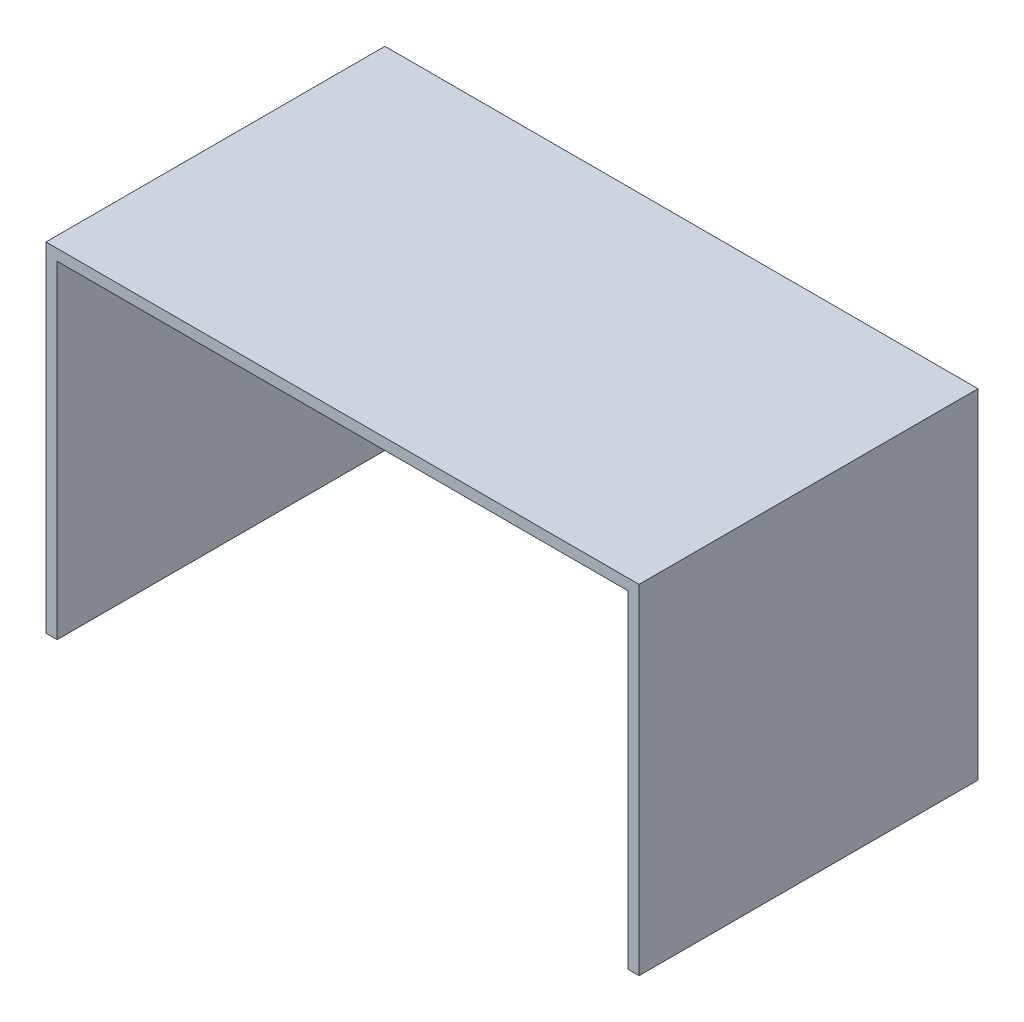
ISO-10303-21;
HEADER;
FILE_DESCRIPTION(('STEP AP214'),'2;1');
FILE_NAME('part.step','',(''),(''),'','','');
FILE_SCHEMA(('AUTOMOTIVE_DESIGN { 1 0 10303 214 1 1 1 1 }'));
ENDSEC;
DATA;
#1=APPLICATION_CONTEXT('core data for automotive mechanical design processes');
#2=APPLICATION_PROTOCOL_DEFINITION('international standard','automotive_design',2000,#1);
#3=PRODUCT_CONTEXT('',#1,'mechanical');
#4=PRODUCT('Part','Part','',(#3));
#5=PRODUCT_RELATED_PRODUCT_CATEGORY('part','',(#4));
#6=PRODUCT_DEFINITION_FORMATION('','',#4);
#7=PRODUCT_DEFINITION_CONTEXT('part definition',#1,'design');
#8=PRODUCT_DEFINITION('design','',#6,#7);
#9=PRODUCT_DEFINITION_SHAPE('','',#8);
#10=(LENGTH_UNIT() NAMED_UNIT(*) SI_UNIT(.MILLI.,.METRE.));
#11=(NAMED_UNIT(*) PLANE_ANGLE_UNIT() SI_UNIT($,.RADIAN.));
#12=(NAMED_UNIT(*) SI_UNIT($,.STERADIAN.) SOLID_ANGLE_UNIT());
#13=UNCERTAINTY_MEASURE_WITH_UNIT(LENGTH_MEASURE(1.E-05),#10,'distance_accuracy_value','');
#14=(GEOMETRIC_REPRESENTATION_CONTEXT(3) GLOBAL_UNCERTAINTY_ASSIGNED_CONTEXT((#13)) GLOBAL_UNIT_ASSIGNED_CONTEXT((#10,
#11,#12)) REPRESENTATION_CONTEXT('',''));
#15=CARTESIAN_POINT('',(0.,0.,0.));
#16=DIRECTION('',(0.,0.,1.));
#17=DIRECTION('',(1.,0.,0.));
#18=AXIS2_PLACEMENT_3D('',#15,#16,#17);
#19=CARTESIAN_POINT('',(0.2667,-0.1524,0.1524));
#20=DIRECTION('',(-1.,0.,0.));
#21=DIRECTION('',(0.,0.,1.));
#22=AXIS2_PLACEMENT_3D('',#19,#20,#21);
#23=PLANE('',#22);
#24=DIRECTION('',(0.,1.,0.));
#25=VECTOR('',#24,1.);
#26=CARTESIAN_POINT('',(0.2667,-0.1524,-0.1524));
#27=LINE('',#26,#25);
#28=CARTESIAN_POINT('',(0.2667,-0.1524,-0.1524));
#29=VERTEX_POINT('',#28);
#30=CARTESIAN_POINT('',(0.2667,0.1524,-0.1524));
#31=VERTEX_POINT('',#30);
#32=EDGE_CURVE('E145',#29,#31,#27,.T.);
#33=ORIENTED_EDGE('',*,*,#32,.T.);
#34=DIRECTION('',(0.,0.,-1.));
#35=VECTOR('',#34,1.);
#36=CARTESIAN_POINT('',(0.2667,0.1524,0.1524));
#37=LINE('',#36,#35);
#38=CARTESIAN_POINT('',(0.2667,0.1524,0.1524));
#39=VERTEX_POINT('',#38);
#40=EDGE_CURVE('E12',#39,#31,#37,.T.);
#41=ORIENTED_EDGE('',*,*,#40,.F.);
#42=DIRECTION('',(0.,1.,0.));
#43=VECTOR('',#42,1.);
#44=CARTESIAN_POINT('',(0.2667,-0.1524,0.1524));
#45=LINE('',#44,#43);
#46=CARTESIAN_POINT('',(0.2667,-0.1524,0.1524));
#47=VERTEX_POINT('',#46);
#48=EDGE_CURVE('E146',#47,#39,#45,.T.);
#49=ORIENTED_EDGE('',*,*,#48,.F.);
#50=DIRECTION('',(0.,0.,-1.));
#51=VECTOR('',#50,1.);
#52=CARTESIAN_POINT('',(0.2667,-0.1524,0.1524));
#53=LINE('',#52,#51);
#54=EDGE_CURVE('E158',#47,#29,#53,.T.);
#55=ORIENTED_EDGE('',*,*,#54,.T.);
#56=EDGE_LOOP('',(#33,#41,#49,#55));
#57=FACE_BOUND('',#56,.T.);
#58=ADVANCED_FACE('F41',(#57),#23,.F.);
#59=CARTESIAN_POINT('',(-0.2667,0.1524,0.1524));
#60=DIRECTION('',(0.,-1.,0.));
#61=DIRECTION('',(0.,0.,-1.));
#62=AXIS2_PLACEMENT_3D('',#59,#60,#61);
#63=PLANE('',#62);
#64=DIRECTION('',(-1.,0.,0.));
#65=VECTOR('',#64,1.);
#66=CARTESIAN_POINT('',(-0.2667,0.1524,-0.1524));
#67=LINE('',#66,#65);
#68=CARTESIAN_POINT('',(-0.2667,0.1524,-0.1524));
#69=VERTEX_POINT('',#68);
#70=EDGE_CURVE('E162',#31,#69,#67,.T.);
#71=ORIENTED_EDGE('',*,*,#70,.T.);
#72=DIRECTION('',(0.,0.,-1.));
#73=VECTOR('',#72,1.);
#74=CARTESIAN_POINT('',(-0.2667,0.1524,0.1524));
#75=LINE('',#74,#73);
#76=CARTESIAN_POINT('',(-0.2667,0.1524,0.1524));
#77=VERTEX_POINT('',#76);
#78=EDGE_CURVE('E49',#77,#69,#75,.T.);
#79=ORIENTED_EDGE('',*,*,#78,.F.);
#80=DIRECTION('',(-1.,0.,0.));
#81=VECTOR('',#80,1.);
#82=CARTESIAN_POINT('',(-0.2667,0.1524,0.1524));
#83=LINE('',#82,#81);
#84=EDGE_CURVE('E94',#39,#77,#83,.T.);
#85=ORIENTED_EDGE('',*,*,#84,.F.);
#86=ORIENTED_EDGE('',*,*,#40,.T.);
#87=EDGE_LOOP('',(#71,#79,#85,#86));
#88=FACE_BOUND('',#87,.T.);
#89=ADVANCED_FACE('F218',(#88),#63,.F.);
#90=CARTESIAN_POINT('',(-0.2667,-0.1524,0.1524));
#91=DIRECTION('',(1.,0.,0.));
#92=DIRECTION('',(0.,0.,-1.));
#93=AXIS2_PLACEMENT_3D('',#90,#91,#92);
#94=PLANE('',#93);
#95=DIRECTION('',(0.,-1.,0.));
#96=VECTOR('',#95,1.);
#97=CARTESIAN_POINT('',(-0.2667,-0.1524,-0.1524));
#98=LINE('',#97,#96);
#99=CARTESIAN_POINT('',(-0.2667,-0.1524,-0.1524));
#100=VERTEX_POINT('',#99);
#101=EDGE_CURVE('E165',#69,#100,#98,.T.);
#102=ORIENTED_EDGE('',*,*,#101,.T.);
#103=DIRECTION('',(0.,0.,-1.));
#104=VECTOR('',#103,1.);
#105=CARTESIAN_POINT('',(-0.2667,-0.1524,0.1524));
#106=LINE('',#105,#104);
#107=CARTESIAN_POINT('',(-0.2667,-0.1524,0.1524));
#108=VERTEX_POINT('',#107);
#109=EDGE_CURVE('E172',#108,#100,#106,.T.);
#110=ORIENTED_EDGE('',*,*,#109,.F.);
#111=DIRECTION('',(0.,-1.,0.));
#112=VECTOR('',#111,1.);
#113=CARTESIAN_POINT('',(-0.2667,-0.1524,0.1524));
#114=LINE('',#113,#112);
#115=EDGE_CURVE('E151',#77,#108,#114,.T.);
#116=ORIENTED_EDGE('',*,*,#115,.F.);
#117=ORIENTED_EDGE('',*,*,#78,.T.);
#118=EDGE_LOOP('',(#102,#110,#116,#117));
#119=FACE_BOUND('',#118,.T.);
#120=ADVANCED_FACE('F179',(#119),#94,.F.);
#121=CARTESIAN_POINT('',(-0.2667,-0.1524,0.1524));
#122=DIRECTION('',(0.,1.,0.));
#123=DIRECTION('',(0.,0.,1.));
#124=AXIS2_PLACEMENT_3D('',#121,#122,#123);
#125=PLANE('',#124);
#126=DIRECTION('',(1.,0.,0.));
#127=VECTOR('',#126,1.);
#128=CARTESIAN_POINT('',(-0.2667,-0.1524,0.1524));
#129=LINE('',#128,#127);
#130=CARTESIAN_POINT('',(0.2567,-0.1524,0.1524));
#131=VERTEX_POINT('',#130);
#132=EDGE_CURVE('E65',#131,#47,#129,.T.);
#133=ORIENTED_EDGE('',*,*,#132,.F.);
#134=DIRECTION('',(0.,0.,1.));
#135=VECTOR('',#134,1.);
#136=CARTESIAN_POINT('',(0.2567,-0.1524,-0.744419087530123));
#137=LINE('',#136,#135);
#138=CARTESIAN_POINT('',(0.2567,-0.1524,-0.1424));
#139=VERTEX_POINT('',#138);
#140=EDGE_CURVE('E122',#139,#131,#137,.T.);
#141=ORIENTED_EDGE('',*,*,#140,.F.);
#142=DIRECTION('',(1.,0.,0.));
#143=VECTOR('',#142,1.);
#144=CARTESIAN_POINT('',(-0.2567,-0.1524,-0.1424));
#145=LINE('',#144,#143);
#146=CARTESIAN_POINT('',(-0.2567,-0.1524,-0.1424));
#147=VERTEX_POINT('',#146);
#148=EDGE_CURVE('E129',#147,#139,#145,.T.);
#149=ORIENTED_EDGE('',*,*,#148,.F.);
#150=DIRECTION('',(0.,0.,1.));
#151=VECTOR('',#150,1.);
#152=CARTESIAN_POINT('',(-0.2567,-0.1524,-0.744419087530123));
#153=LINE('',#152,#151);
#154=CARTESIAN_POINT('',(-0.2567,-0.1524,0.1524));
#155=VERTEX_POINT('',#154);
#156=EDGE_CURVE('E142',#147,#155,#153,.T.);
#157=ORIENTED_EDGE('',*,*,#156,.T.);
#158=EDGE_CURVE('E154',#108,#155,#129,.T.);
#159=ORIENTED_EDGE('',*,*,#158,.F.);
#160=ORIENTED_EDGE('',*,*,#109,.T.);
#161=DIRECTION('',(1.,0.,0.));
#162=VECTOR('',#161,1.);
#163=CARTESIAN_POINT('',(-0.2667,-0.1524,-0.1524));
#164=LINE('',#163,#162);
#165=EDGE_CURVE('E87',#100,#29,#164,.T.);
#166=ORIENTED_EDGE('',*,*,#165,.T.);
#167=ORIENTED_EDGE('',*,*,#54,.F.);
#168=EDGE_LOOP('',(#133,#141,#149,#157,#159,#160,#166,#167));
#169=FACE_BOUND('',#168,.T.);
#170=ADVANCED_FACE('F136',(#169),#125,.F.);
#171=CARTESIAN_POINT('',(0.,0.,0.1524));
#172=DIRECTION('',(0.,0.,-1.));
#173=DIRECTION('',(-1.,0.,0.));
#174=AXIS2_PLACEMENT_3D('',#171,#172,#173);
#175=PLANE('',#174);
#176=DIRECTION('',(-1.,0.,0.));
#177=VECTOR('',#176,1.);
#178=CARTESIAN_POINT('',(-0.2567,0.1424,0.1524));
#179=LINE('',#178,#177);
#180=CARTESIAN_POINT('',(0.2567,0.1424,0.1524));
#181=VERTEX_POINT('',#180);
#182=CARTESIAN_POINT('',(-0.2567,0.1424,0.1524));
#183=VERTEX_POINT('',#182);
#184=EDGE_CURVE('E56',#181,#183,#179,.T.);
#185=ORIENTED_EDGE('',*,*,#184,.F.);
#186=DIRECTION('',(0.,1.,0.));
#187=VECTOR('',#186,1.);
#188=CARTESIAN_POINT('',(0.2567,0.1424,0.1524));
#189=LINE('',#188,#187);
#190=EDGE_CURVE('E195',#131,#181,#189,.T.);
#191=ORIENTED_EDGE('',*,*,#190,.F.);
#192=ORIENTED_EDGE('',*,*,#132,.T.);
#193=ORIENTED_EDGE('',*,*,#48,.T.);
#194=ORIENTED_EDGE('',*,*,#84,.T.);
#195=ORIENTED_EDGE('',*,*,#115,.T.);
#196=ORIENTED_EDGE('',*,*,#158,.T.);
#197=DIRECTION('',(0.,-1.,0.));
#198=VECTOR('',#197,1.);
#199=CARTESIAN_POINT('',(-0.2567,0.1424,0.1524));
#200=LINE('',#199,#198);
#201=EDGE_CURVE('E192',#183,#155,#200,.T.);
#202=ORIENTED_EDGE('',*,*,#201,.F.);
#203=EDGE_LOOP('',(#185,#191,#192,#193,#194,#195,#196,#202));
#204=FACE_BOUND('',#203,.T.);
#205=ADVANCED_FACE('F187',(#204),#175,.F.);
#206=CARTESIAN_POINT('',(0.,0.,-0.1524));
#207=DIRECTION('',(0.,0.,-1.));
#208=DIRECTION('',(-1.,0.,0.));
#209=AXIS2_PLACEMENT_3D('',#206,#207,#208);
#210=PLANE('',#209);
#211=ORIENTED_EDGE('',*,*,#32,.F.);
#212=ORIENTED_EDGE('',*,*,#165,.F.);
#213=ORIENTED_EDGE('',*,*,#101,.F.);
#214=ORIENTED_EDGE('',*,*,#70,.F.);
#215=EDGE_LOOP('',(#211,#212,#213,#214));
#216=FACE_BOUND('',#215,.T.);
#217=ADVANCED_FACE('F183',(#216),#210,.T.);
#218=CARTESIAN_POINT('',(0.,0.,-0.1424));
#219=DIRECTION('',(0.,0.,-1.));
#220=DIRECTION('',(-1.,0.,0.));
#221=AXIS2_PLACEMENT_3D('',#218,#219,#220);
#222=PLANE('',#221);
#223=DIRECTION('',(0.,-1.,0.));
#224=VECTOR('',#223,1.);
#225=CARTESIAN_POINT('',(-0.2567,0.1424,-0.1424));
#226=LINE('',#225,#224);
#227=CARTESIAN_POINT('',(-0.2567,0.1424,-0.1424));
#228=VERTEX_POINT('',#227);
#229=EDGE_CURVE('E131',#228,#147,#226,.T.);
#230=ORIENTED_EDGE('',*,*,#229,.T.);
#231=ORIENTED_EDGE('',*,*,#148,.T.);
#232=DIRECTION('',(0.,1.,0.));
#233=VECTOR('',#232,1.);
#234=CARTESIAN_POINT('',(0.2567,0.1424,-0.1424));
#235=LINE('',#234,#233);
#236=CARTESIAN_POINT('',(0.2567,0.1424,-0.1424));
#237=VERTEX_POINT('',#236);
#238=EDGE_CURVE('E117',#139,#237,#235,.T.);
#239=ORIENTED_EDGE('',*,*,#238,.T.);
#240=DIRECTION('',(-1.,0.,0.));
#241=VECTOR('',#240,1.);
#242=CARTESIAN_POINT('',(-0.2567,0.1424,-0.1424));
#243=LINE('',#242,#241);
#244=EDGE_CURVE('E203',#237,#228,#243,.T.);
#245=ORIENTED_EDGE('',*,*,#244,.T.);
#246=EDGE_LOOP('',(#230,#231,#239,#245));
#247=FACE_BOUND('',#246,.T.);
#248=ADVANCED_FACE('F130',(#247),#222,.F.);
#249=CARTESIAN_POINT('',(0.2567,0.1424,-0.744419087530123));
#250=DIRECTION('',(1.,0.,0.));
#251=DIRECTION('',(0.,0.,-1.));
#252=AXIS2_PLACEMENT_3D('',#249,#250,#251);
#253=PLANE('',#252);
#254=ORIENTED_EDGE('',*,*,#140,.T.);
#255=ORIENTED_EDGE('',*,*,#190,.T.);
#256=DIRECTION('',(0.,0.,1.));
#257=VECTOR('',#256,1.);
#258=CARTESIAN_POINT('',(0.2567,0.1424,-0.744419087530123));
#259=LINE('',#258,#257);
#260=EDGE_CURVE('E123',#237,#181,#259,.T.);
#261=ORIENTED_EDGE('',*,*,#260,.F.);
#262=ORIENTED_EDGE('',*,*,#238,.F.);
#263=EDGE_LOOP('',(#254,#255,#261,#262));
#264=FACE_BOUND('',#263,.T.);
#265=ADVANCED_FACE('F119',(#264),#253,.F.);
#266=CARTESIAN_POINT('',(-0.2567,0.1424,-0.744419087530123));
#267=DIRECTION('',(0.,1.,0.));
#268=DIRECTION('',(0.,0.,1.));
#269=AXIS2_PLACEMENT_3D('',#266,#267,#268);
#270=PLANE('',#269);
#271=ORIENTED_EDGE('',*,*,#260,.T.);
#272=ORIENTED_EDGE('',*,*,#184,.T.);
#273=DIRECTION('',(0.,0.,1.));
#274=VECTOR('',#273,1.);
#275=CARTESIAN_POINT('',(-0.2567,0.1424,-0.744419087530123));
#276=LINE('',#275,#274);
#277=EDGE_CURVE('E193',#228,#183,#276,.T.);
#278=ORIENTED_EDGE('',*,*,#277,.F.);
#279=ORIENTED_EDGE('',*,*,#244,.F.);
#280=EDGE_LOOP('',(#271,#272,#278,#279));
#281=FACE_BOUND('',#280,.T.);
#282=ADVANCED_FACE('F207',(#281),#270,.F.);
#283=CARTESIAN_POINT('',(-0.2567,0.1424,-0.744419087530123));
#284=DIRECTION('',(-1.,0.,0.));
#285=DIRECTION('',(0.,0.,1.));
#286=AXIS2_PLACEMENT_3D('',#283,#284,#285);
#287=PLANE('',#286);
#288=ORIENTED_EDGE('',*,*,#277,.T.);
#289=ORIENTED_EDGE('',*,*,#201,.T.);
#290=ORIENTED_EDGE('',*,*,#156,.F.);
#291=ORIENTED_EDGE('',*,*,#229,.F.);
#292=EDGE_LOOP('',(#288,#289,#290,#291));
#293=FACE_BOUND('',#292,.T.);
#294=ADVANCED_FACE('F191',(#293),#287,.F.);
#295=CLOSED_SHELL('',(#58,#89,#120,#170,#205,#217,#248,#265,#282,#294));
#296=MANIFOLD_SOLID_BREP('B2',#295);
#297=ADVANCED_BREP_SHAPE_REPRESENTATION('',(#18,#296),#14);
#298=SHAPE_DEFINITION_REPRESENTATION(#9,#297);
ENDSEC;
END-ISO-10303-21;
